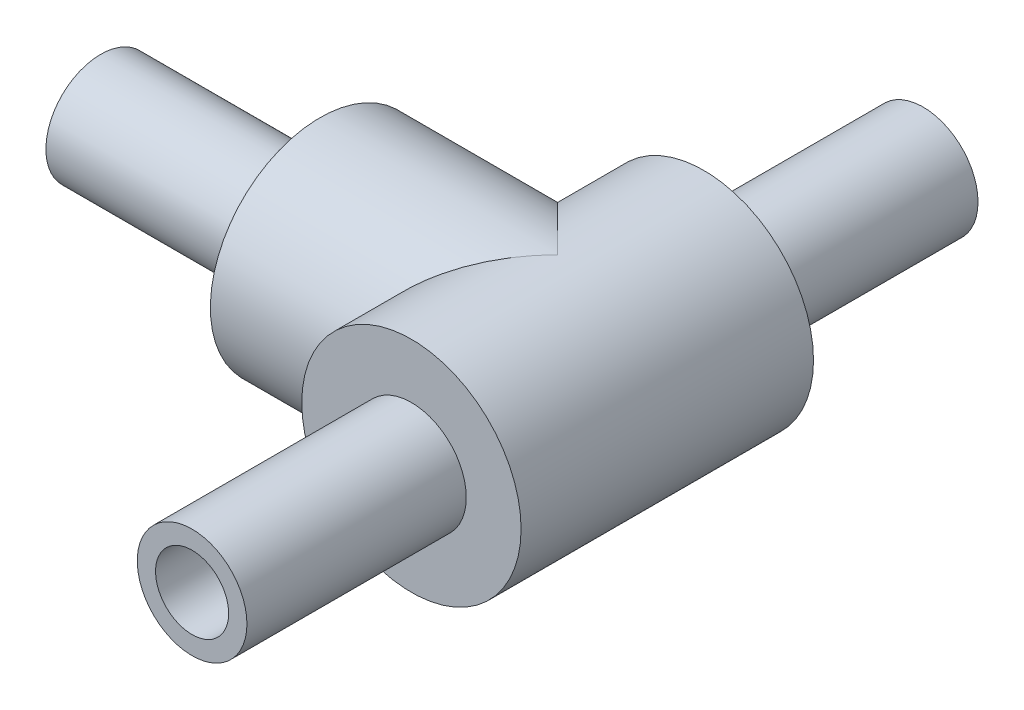
ISO-10303-21;
HEADER;
FILE_DESCRIPTION(('STEP AP214'),'2;1');
FILE_NAME('part.step','',(''),(''),'','','');
FILE_SCHEMA(('AUTOMOTIVE_DESIGN { 1 0 10303 214 1 1 1 1 }'));
ENDSEC;
DATA;
#1=APPLICATION_CONTEXT('core data for automotive mechanical design processes');
#2=APPLICATION_PROTOCOL_DEFINITION('international standard','automotive_design',2000,#1);
#3=PRODUCT_CONTEXT('',#1,'mechanical');
#4=PRODUCT('Part','Part','',(#3));
#5=PRODUCT_RELATED_PRODUCT_CATEGORY('part','',(#4));
#6=PRODUCT_DEFINITION_FORMATION('','',#4);
#7=PRODUCT_DEFINITION_CONTEXT('part definition',#1,'design');
#8=PRODUCT_DEFINITION('design','',#6,#7);
#9=PRODUCT_DEFINITION_SHAPE('','',#8);
#10=(LENGTH_UNIT() NAMED_UNIT(*) SI_UNIT(.MILLI.,.METRE.));
#11=(NAMED_UNIT(*) PLANE_ANGLE_UNIT() SI_UNIT($,.RADIAN.));
#12=(NAMED_UNIT(*) SI_UNIT($,.STERADIAN.) SOLID_ANGLE_UNIT());
#13=UNCERTAINTY_MEASURE_WITH_UNIT(LENGTH_MEASURE(1.E-05),#10,'distance_accuracy_value','');
#14=(GEOMETRIC_REPRESENTATION_CONTEXT(3) GLOBAL_UNCERTAINTY_ASSIGNED_CONTEXT((#13)) GLOBAL_UNIT_ASSIGNED_CONTEXT((#10,
#11,#12)) REPRESENTATION_CONTEXT('',''));
#15=CARTESIAN_POINT('',(0.,0.,0.));
#16=DIRECTION('',(0.,0.,1.));
#17=DIRECTION('',(1.,0.,0.));
#18=AXIS2_PLACEMENT_3D('',#15,#16,#17);
#19=CARTESIAN_POINT('',(0.,0.,20.));
#20=DIRECTION('',(0.,0.,-1.));
#21=DIRECTION('',(-1.,0.,0.));
#22=AXIS2_PLACEMENT_3D('',#19,#20,#21);
#23=CYLINDRICAL_SURFACE('',#22,2.);
#24=CARTESIAN_POINT('',(0.,0.,20.));
#25=DIRECTION('',(0.,0.,1.));
#26=DIRECTION('',(1.,0.,0.));
#27=AXIS2_PLACEMENT_3D('',#24,#25,#26);
#28=CIRCLE('',#27,2.);
#29=CARTESIAN_POINT('',(2.,0.,20.));
#30=VERTEX_POINT('',#29);
#31=EDGE_CURVE('E157',#30,#30,#28,.T.);
#32=ORIENTED_EDGE('',*,*,#31,.T.);
#33=EDGE_LOOP('',(#32));
#34=FACE_BOUND('',#33,.T.);
#35=CARTESIAN_POINT('',(0.,0.,-20.));
#36=DIRECTION('',(0.,0.,1.));
#37=DIRECTION('',(1.,0.,0.));
#38=AXIS2_PLACEMENT_3D('',#35,#36,#37);
#39=CIRCLE('',#38,2.);
#40=CARTESIAN_POINT('',(2.,0.,-20.));
#41=VERTEX_POINT('',#40);
#42=EDGE_CURVE('E158',#41,#41,#39,.T.);
#43=ORIENTED_EDGE('',*,*,#42,.F.);
#44=EDGE_LOOP('',(#43));
#45=FACE_BOUND('',#44,.T.);
#46=CARTESIAN_POINT('',(0.,0.,0.));
#47=DIRECTION('',(0.707106781186547,0.,-0.707106781186547));
#48=DIRECTION('',(-0.707106781186547,0.,-0.707106781186547));
#49=AXIS2_PLACEMENT_3D('',#46,#47,#48);
#50=ELLIPSE('',#49,2.82842712474619,2.);
#51=CARTESIAN_POINT('',(0.,2.,0.));
#52=VERTEX_POINT('',#51);
#53=CARTESIAN_POINT('',(0.,-2.,0.));
#54=VERTEX_POINT('',#53);
#55=EDGE_CURVE('E51',#52,#54,#50,.F.);
#56=ORIENTED_EDGE('',*,*,#55,.T.);
#57=CARTESIAN_POINT('',(0.,0.,0.));
#58=DIRECTION('',(-0.707106781186547,0.,-0.707106781186547));
#59=DIRECTION('',(0.707106781186547,0.,-0.707106781186547));
#60=AXIS2_PLACEMENT_3D('',#57,#58,#59);
#61=ELLIPSE('',#60,2.82842712474619,2.);
#62=EDGE_CURVE('E11',#54,#52,#61,.T.);
#63=ORIENTED_EDGE('',*,*,#62,.T.);
#64=EDGE_LOOP('',(#56,#63));
#65=FACE_BOUND('',#64,.T.);
#66=ADVANCED_FACE('F43',(#34,#45,#65),#23,.F.);
#67=CARTESIAN_POINT('',(0.,0.,8.));
#68=DIRECTION('',(0.,0.,-1.));
#69=DIRECTION('',(-1.,0.,0.));
#70=AXIS2_PLACEMENT_3D('',#67,#68,#69);
#71=CYLINDRICAL_SURFACE('',#70,6.);
#72=CARTESIAN_POINT('',(0.,0.,-8.));
#73=DIRECTION('',(0.,0.,1.));
#74=DIRECTION('',(1.,0.,0.));
#75=AXIS2_PLACEMENT_3D('',#72,#73,#74);
#76=CIRCLE('',#75,6.);
#77=CARTESIAN_POINT('',(6.,0.,-8.));
#78=VERTEX_POINT('',#77);
#79=EDGE_CURVE('E129',#78,#78,#76,.T.);
#80=ORIENTED_EDGE('',*,*,#79,.T.);
#81=EDGE_LOOP('',(#80));
#82=FACE_BOUND('',#81,.T.);
#83=CARTESIAN_POINT('',(0.,0.,8.));
#84=DIRECTION('',(0.,0.,1.));
#85=DIRECTION('',(1.,0.,0.));
#86=AXIS2_PLACEMENT_3D('',#83,#84,#85);
#87=CIRCLE('',#86,6.);
#88=CARTESIAN_POINT('',(6.,0.,8.));
#89=VERTEX_POINT('',#88);
#90=EDGE_CURVE('E126',#89,#89,#87,.T.);
#91=ORIENTED_EDGE('',*,*,#90,.F.);
#92=EDGE_LOOP('',(#91));
#93=FACE_BOUND('',#92,.T.);
#94=CARTESIAN_POINT('',(0.,0.,0.));
#95=DIRECTION('',(-0.707106781186547,0.,-0.707106781186547));
#96=DIRECTION('',(0.707106781186547,0.,-0.707106781186547));
#97=AXIS2_PLACEMENT_3D('',#94,#95,#96);
#98=ELLIPSE('',#97,8.48528137423857,6.);
#99=CARTESIAN_POINT('',(0.,-6.,0.));
#100=VERTEX_POINT('',#99);
#101=CARTESIAN_POINT('',(0.,6.,0.));
#102=VERTEX_POINT('',#101);
#103=EDGE_CURVE('E136',#100,#102,#98,.T.);
#104=ORIENTED_EDGE('',*,*,#103,.F.);
#105=CARTESIAN_POINT('',(0.,0.,0.));
#106=DIRECTION('',(0.707106781186547,0.,-0.707106781186547));
#107=DIRECTION('',(-0.707106781186547,0.,-0.707106781186547));
#108=AXIS2_PLACEMENT_3D('',#105,#106,#107);
#109=ELLIPSE('',#108,8.48528137423857,6.);
#110=EDGE_CURVE('E65',#102,#100,#109,.F.);
#111=ORIENTED_EDGE('',*,*,#110,.F.);
#112=EDGE_LOOP('',(#104,#111));
#113=FACE_BOUND('',#112,.T.);
#114=ADVANCED_FACE('F44',(#82,#93,#113),#71,.T.);
#115=CARTESIAN_POINT('',(0.,0.,8.));
#116=DIRECTION('',(0.,0.,1.));
#117=DIRECTION('',(1.,0.,0.));
#118=AXIS2_PLACEMENT_3D('',#115,#116,#117);
#119=PLANE('',#118);
#120=CARTESIAN_POINT('',(0.,0.,8.));
#121=DIRECTION('',(0.,0.,1.));
#122=DIRECTION('',(1.,0.,0.));
#123=AXIS2_PLACEMENT_3D('',#120,#121,#122);
#124=CIRCLE('',#123,3.);
#125=CARTESIAN_POINT('',(3.,0.,8.));
#126=VERTEX_POINT('',#125);
#127=EDGE_CURVE('E66',#126,#126,#124,.T.);
#128=ORIENTED_EDGE('',*,*,#127,.F.);
#129=EDGE_LOOP('',(#128));
#130=FACE_BOUND('',#129,.T.);
#131=ORIENTED_EDGE('',*,*,#90,.T.);
#132=EDGE_LOOP('',(#131));
#133=FACE_BOUND('',#132,.T.);
#134=ADVANCED_FACE('F79',(#130,#133),#119,.T.);
#135=CARTESIAN_POINT('',(0.,0.,-8.));
#136=DIRECTION('',(0.,0.,1.));
#137=DIRECTION('',(1.,0.,0.));
#138=AXIS2_PLACEMENT_3D('',#135,#136,#137);
#139=PLANE('',#138);
#140=CARTESIAN_POINT('',(0.,0.,-8.));
#141=DIRECTION('',(0.,0.,1.));
#142=DIRECTION('',(1.,0.,0.));
#143=AXIS2_PLACEMENT_3D('',#140,#141,#142);
#144=CIRCLE('',#143,3.);
#145=CARTESIAN_POINT('',(3.,0.,-8.));
#146=VERTEX_POINT('',#145);
#147=EDGE_CURVE('E123',#146,#146,#144,.T.);
#148=ORIENTED_EDGE('',*,*,#147,.T.);
#149=EDGE_LOOP('',(#148));
#150=FACE_BOUND('',#149,.T.);
#151=ORIENTED_EDGE('',*,*,#79,.F.);
#152=EDGE_LOOP('',(#151));
#153=FACE_BOUND('',#152,.T.);
#154=ADVANCED_FACE('F112',(#150,#153),#139,.F.);
#155=CARTESIAN_POINT('',(0.,0.,0.));
#156=DIRECTION('',(-1.,0.,0.));
#157=DIRECTION('',(0.,0.,1.));
#158=AXIS2_PLACEMENT_3D('',#155,#156,#157);
#159=CYLINDRICAL_SURFACE('',#158,6.);
#160=CARTESIAN_POINT('',(-13.,0.,0.));
#161=DIRECTION('',(1.,0.,0.));
#162=DIRECTION('',(0.,0.,-1.));
#163=AXIS2_PLACEMENT_3D('',#160,#161,#162);
#164=CIRCLE('',#163,6.);
#165=CARTESIAN_POINT('',(-13.,0.,-6.));
#166=VERTEX_POINT('',#165);
#167=EDGE_CURVE('E128',#166,#166,#164,.T.);
#168=ORIENTED_EDGE('',*,*,#167,.T.);
#169=EDGE_LOOP('',(#168));
#170=FACE_BOUND('',#169,.T.);
#171=ORIENTED_EDGE('',*,*,#110,.T.);
#172=ORIENTED_EDGE('',*,*,#103,.T.);
#173=EDGE_LOOP('',(#171,#172));
#174=FACE_BOUND('',#173,.T.);
#175=ADVANCED_FACE('F109',(#170,#174),#159,.T.);
#176=CARTESIAN_POINT('',(-13.,0.,0.));
#177=DIRECTION('',(1.,0.,0.));
#178=DIRECTION('',(0.,0.,-1.));
#179=AXIS2_PLACEMENT_3D('',#176,#177,#178);
#180=PLANE('',#179);
#181=CARTESIAN_POINT('',(-13.,0.,0.));
#182=DIRECTION('',(1.,0.,0.));
#183=DIRECTION('',(0.,0.,-1.));
#184=AXIS2_PLACEMENT_3D('',#181,#182,#183);
#185=CIRCLE('',#184,3.);
#186=CARTESIAN_POINT('',(-13.,0.,-3.));
#187=VERTEX_POINT('',#186);
#188=EDGE_CURVE('E153',#187,#187,#185,.T.);
#189=ORIENTED_EDGE('',*,*,#188,.T.);
#190=EDGE_LOOP('',(#189));
#191=FACE_BOUND('',#190,.T.);
#192=ORIENTED_EDGE('',*,*,#167,.F.);
#193=EDGE_LOOP('',(#192));
#194=FACE_BOUND('',#193,.T.);
#195=ADVANCED_FACE('F106',(#191,#194),#180,.F.);
#196=CARTESIAN_POINT('',(0.,0.,20.));
#197=DIRECTION('',(0.,0.,-1.));
#198=DIRECTION('',(-1.,0.,0.));
#199=AXIS2_PLACEMENT_3D('',#196,#197,#198);
#200=CYLINDRICAL_SURFACE('',#199,3.);
#201=CARTESIAN_POINT('',(0.,0.,20.));
#202=DIRECTION('',(0.,0.,1.));
#203=DIRECTION('',(1.,0.,0.));
#204=AXIS2_PLACEMENT_3D('',#201,#202,#203);
#205=CIRCLE('',#204,3.);
#206=CARTESIAN_POINT('',(3.,0.,20.));
#207=VERTEX_POINT('',#206);
#208=EDGE_CURVE('E131',#207,#207,#205,.T.);
#209=ORIENTED_EDGE('',*,*,#208,.F.);
#210=EDGE_LOOP('',(#209));
#211=FACE_BOUND('',#210,.T.);
#212=ORIENTED_EDGE('',*,*,#127,.T.);
#213=EDGE_LOOP('',(#212));
#214=FACE_BOUND('',#213,.T.);
#215=ADVANCED_FACE('F105',(#211,#214),#200,.T.);
#216=CARTESIAN_POINT('',(0.,0.,20.));
#217=DIRECTION('',(0.,0.,1.));
#218=DIRECTION('',(1.,0.,0.));
#219=AXIS2_PLACEMENT_3D('',#216,#217,#218);
#220=PLANE('',#219);
#221=ORIENTED_EDGE('',*,*,#31,.F.);
#222=EDGE_LOOP('',(#221));
#223=FACE_BOUND('',#222,.T.);
#224=ORIENTED_EDGE('',*,*,#208,.T.);
#225=EDGE_LOOP('',(#224));
#226=FACE_BOUND('',#225,.T.);
#227=ADVANCED_FACE('F96',(#223,#226),#220,.T.);
#228=CARTESIAN_POINT('',(0.,0.,-8.));
#229=DIRECTION('',(0.,0.,-1.));
#230=DIRECTION('',(-1.,0.,0.));
#231=AXIS2_PLACEMENT_3D('',#228,#229,#230);
#232=CYLINDRICAL_SURFACE('',#231,3.);
#233=ORIENTED_EDGE('',*,*,#147,.F.);
#234=EDGE_LOOP('',(#233));
#235=FACE_BOUND('',#234,.T.);
#236=CARTESIAN_POINT('',(0.,0.,-20.));
#237=DIRECTION('',(0.,0.,1.));
#238=DIRECTION('',(1.,0.,0.));
#239=AXIS2_PLACEMENT_3D('',#236,#237,#238);
#240=CIRCLE('',#239,3.);
#241=CARTESIAN_POINT('',(3.,0.,-20.));
#242=VERTEX_POINT('',#241);
#243=EDGE_CURVE('E149',#242,#242,#240,.T.);
#244=ORIENTED_EDGE('',*,*,#243,.T.);
#245=EDGE_LOOP('',(#244));
#246=FACE_BOUND('',#245,.T.);
#247=ADVANCED_FACE('F91',(#235,#246),#232,.T.);
#248=CARTESIAN_POINT('',(0.,0.,-20.));
#249=DIRECTION('',(0.,0.,1.));
#250=DIRECTION('',(1.,0.,0.));
#251=AXIS2_PLACEMENT_3D('',#248,#249,#250);
#252=PLANE('',#251);
#253=ORIENTED_EDGE('',*,*,#42,.T.);
#254=EDGE_LOOP('',(#253));
#255=FACE_BOUND('',#254,.T.);
#256=ORIENTED_EDGE('',*,*,#243,.F.);
#257=EDGE_LOOP('',(#256));
#258=FACE_BOUND('',#257,.T.);
#259=ADVANCED_FACE('F92',(#255,#258),#252,.F.);
#260=CARTESIAN_POINT('',(-13.,0.,0.));
#261=DIRECTION('',(-1.,0.,0.));
#262=DIRECTION('',(0.,0.,1.));
#263=AXIS2_PLACEMENT_3D('',#260,#261,#262);
#264=CYLINDRICAL_SURFACE('',#263,3.);
#265=ORIENTED_EDGE('',*,*,#188,.F.);
#266=EDGE_LOOP('',(#265));
#267=FACE_BOUND('',#266,.T.);
#268=CARTESIAN_POINT('',(-25.,0.,0.));
#269=DIRECTION('',(1.,0.,0.));
#270=DIRECTION('',(0.,0.,-1.));
#271=AXIS2_PLACEMENT_3D('',#268,#269,#270);
#272=CIRCLE('',#271,3.);
#273=CARTESIAN_POINT('',(-25.,0.,-3.));
#274=VERTEX_POINT('',#273);
#275=EDGE_CURVE('E152',#274,#274,#272,.T.);
#276=ORIENTED_EDGE('',*,*,#275,.T.);
#277=EDGE_LOOP('',(#276));
#278=FACE_BOUND('',#277,.T.);
#279=ADVANCED_FACE('F89',(#267,#278),#264,.T.);
#280=CARTESIAN_POINT('',(-25.,0.,0.));
#281=DIRECTION('',(1.,0.,0.));
#282=DIRECTION('',(0.,0.,-1.));
#283=AXIS2_PLACEMENT_3D('',#280,#281,#282);
#284=PLANE('',#283);
#285=CARTESIAN_POINT('',(-25.,0.,0.));
#286=DIRECTION('',(1.,0.,0.));
#287=DIRECTION('',(0.,0.,-1.));
#288=AXIS2_PLACEMENT_3D('',#285,#286,#287);
#289=CIRCLE('',#288,2.);
#290=CARTESIAN_POINT('',(-25.,0.,-2.));
#291=VERTEX_POINT('',#290);
#292=EDGE_CURVE('E161',#291,#291,#289,.F.);
#293=ORIENTED_EDGE('',*,*,#292,.F.);
#294=EDGE_LOOP('',(#293));
#295=FACE_BOUND('',#294,.T.);
#296=ORIENTED_EDGE('',*,*,#275,.F.);
#297=EDGE_LOOP('',(#296));
#298=FACE_BOUND('',#297,.T.);
#299=ADVANCED_FACE('F83',(#295,#298),#284,.F.);
#300=CARTESIAN_POINT('',(0.,0.,0.));
#301=DIRECTION('',(-1.,0.,0.));
#302=DIRECTION('',(0.,0.,1.));
#303=AXIS2_PLACEMENT_3D('',#300,#301,#302);
#304=CYLINDRICAL_SURFACE('',#303,2.);
#305=ORIENTED_EDGE('',*,*,#55,.F.);
#306=ORIENTED_EDGE('',*,*,#62,.F.);
#307=EDGE_LOOP('',(#305,#306));
#308=FACE_BOUND('',#307,.T.);
#309=ORIENTED_EDGE('',*,*,#292,.T.);
#310=EDGE_LOOP('',(#309));
#311=FACE_BOUND('',#310,.T.);
#312=ADVANCED_FACE('F69',(#308,#311),#304,.F.);
#313=CLOSED_SHELL('',(#66,#114,#134,#154,#175,#195,#215,#227,#247,#259,#279,#299,#312));
#314=MANIFOLD_SOLID_BREP('B2',#313);
#315=ADVANCED_BREP_SHAPE_REPRESENTATION('',(#18,#314),#14);
#316=SHAPE_DEFINITION_REPRESENTATION(#9,#315);
ENDSEC;
END-ISO-10303-21;
